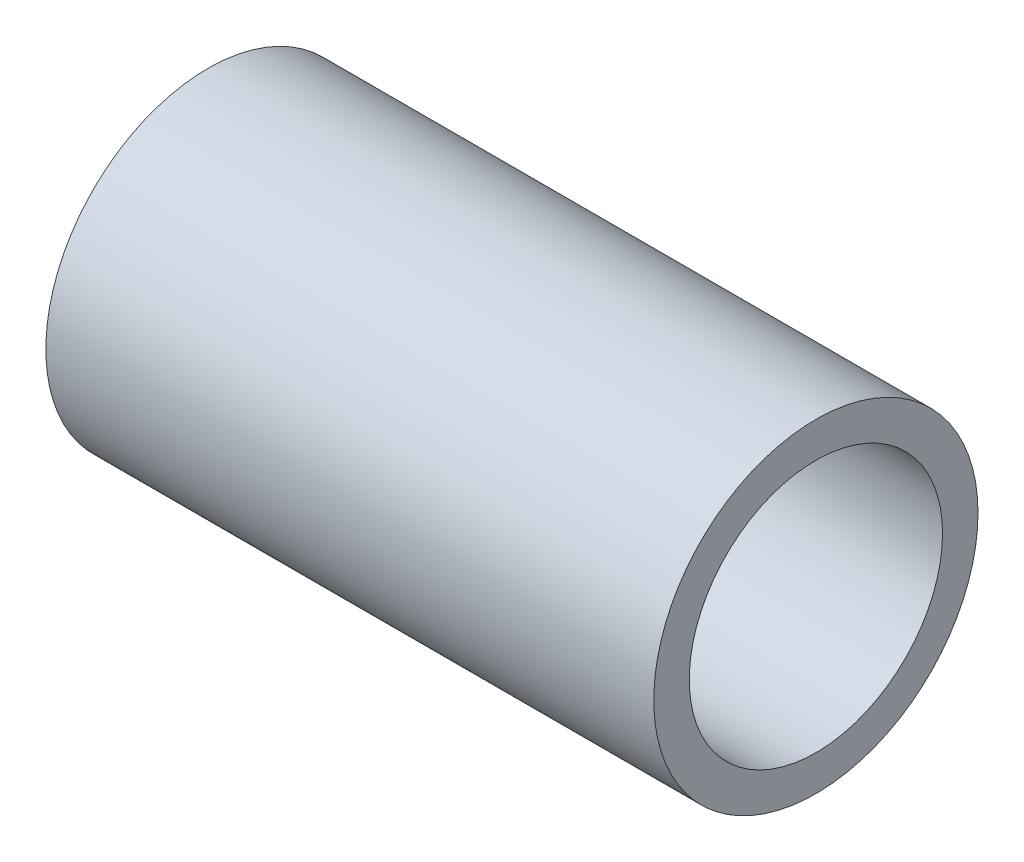
ISO-10303-21;
HEADER;
FILE_DESCRIPTION(('STEP AP214'),'2;1');
FILE_NAME('part.step','',(''),(''),'','','');
FILE_SCHEMA(('AUTOMOTIVE_DESIGN { 1 0 10303 214 1 1 1 1 }'));
ENDSEC;
DATA;
#1=APPLICATION_CONTEXT('core data for automotive mechanical design processes');
#2=APPLICATION_PROTOCOL_DEFINITION('international standard','automotive_design',2000,#1);
#3=PRODUCT_CONTEXT('',#1,'mechanical');
#4=PRODUCT('Part','Part','',(#3));
#5=PRODUCT_RELATED_PRODUCT_CATEGORY('part','',(#4));
#6=PRODUCT_DEFINITION_FORMATION('','',#4);
#7=PRODUCT_DEFINITION_CONTEXT('part definition',#1,'design');
#8=PRODUCT_DEFINITION('design','',#6,#7);
#9=PRODUCT_DEFINITION_SHAPE('','',#8);
#10=(LENGTH_UNIT() NAMED_UNIT(*) SI_UNIT(.MILLI.,.METRE.));
#11=(NAMED_UNIT(*) PLANE_ANGLE_UNIT() SI_UNIT($,.RADIAN.));
#12=(NAMED_UNIT(*) SI_UNIT($,.STERADIAN.) SOLID_ANGLE_UNIT());
#13=UNCERTAINTY_MEASURE_WITH_UNIT(LENGTH_MEASURE(1.E-05),#10,'distance_accuracy_value','');
#14=(GEOMETRIC_REPRESENTATION_CONTEXT(3) GLOBAL_UNCERTAINTY_ASSIGNED_CONTEXT((#13)) GLOBAL_UNIT_ASSIGNED_CONTEXT((#10,
#11,#12)) REPRESENTATION_CONTEXT('',''));
#15=CARTESIAN_POINT('',(0.,0.,0.));
#16=DIRECTION('',(0.,0.,1.));
#17=DIRECTION('',(1.,0.,0.));
#18=AXIS2_PLACEMENT_3D('',#15,#16,#17);
#19=CARTESIAN_POINT('',(30.,0.,0.));
#20=DIRECTION('',(1.,0.,0.));
#21=DIRECTION('',(0.,0.,-1.));
#22=AXIS2_PLACEMENT_3D('',#19,#20,#21);
#23=PLANE('',#22);
#24=CARTESIAN_POINT('',(30.,0.,0.));
#25=DIRECTION('',(1.,0.,0.));
#26=DIRECTION('',(0.,0.,-1.));
#27=AXIS2_PLACEMENT_3D('',#24,#25,#26);
#28=CIRCLE('',#27,8.);
#29=CARTESIAN_POINT('',(30.,0.,-8.));
#30=VERTEX_POINT('',#29);
#31=EDGE_CURVE('E10',#30,#30,#28,.T.);
#32=ORIENTED_EDGE('',*,*,#31,.T.);
#33=EDGE_LOOP('',(#32));
#34=FACE_BOUND('',#33,.T.);
#35=CARTESIAN_POINT('',(30.,0.,0.));
#36=DIRECTION('',(1.,0.,0.));
#37=DIRECTION('',(0.,0.,-1.));
#38=AXIS2_PLACEMENT_3D('',#35,#36,#37);
#39=CIRCLE('',#38,6.25);
#40=CARTESIAN_POINT('',(30.,0.,-6.25));
#41=VERTEX_POINT('',#40);
#42=EDGE_CURVE('E42',#41,#41,#39,.T.);
#43=ORIENTED_EDGE('',*,*,#42,.F.);
#44=EDGE_LOOP('',(#43));
#45=FACE_BOUND('',#44,.T.);
#46=ADVANCED_FACE('F31',(#34,#45),#23,.T.);
#47=CARTESIAN_POINT('',(0.,0.,0.));
#48=DIRECTION('',(1.,0.,0.));
#49=DIRECTION('',(0.,0.,-1.));
#50=AXIS2_PLACEMENT_3D('',#47,#48,#49);
#51=PLANE('',#50);
#52=CARTESIAN_POINT('',(0.,0.,0.));
#53=DIRECTION('',(1.,0.,0.));
#54=DIRECTION('',(0.,0.,-1.));
#55=AXIS2_PLACEMENT_3D('',#52,#53,#54);
#56=CIRCLE('',#55,8.);
#57=CARTESIAN_POINT('',(0.,0.,-8.));
#58=VERTEX_POINT('',#57);
#59=EDGE_CURVE('E35',#58,#58,#56,.T.);
#60=ORIENTED_EDGE('',*,*,#59,.F.);
#61=EDGE_LOOP('',(#60));
#62=FACE_BOUND('',#61,.T.);
#63=CARTESIAN_POINT('',(0.,0.,0.));
#64=DIRECTION('',(1.,0.,0.));
#65=DIRECTION('',(0.,0.,-1.));
#66=AXIS2_PLACEMENT_3D('',#63,#64,#65);
#67=CIRCLE('',#66,6.25);
#68=CARTESIAN_POINT('',(0.,0.,-6.25));
#69=VERTEX_POINT('',#68);
#70=EDGE_CURVE('E44',#69,#69,#67,.T.);
#71=ORIENTED_EDGE('',*,*,#70,.T.);
#72=EDGE_LOOP('',(#71));
#73=FACE_BOUND('',#72,.T.);
#74=ADVANCED_FACE('F54',(#62,#73),#51,.F.);
#75=CARTESIAN_POINT('',(30.,0.,0.));
#76=DIRECTION('',(-1.,0.,0.));
#77=DIRECTION('',(0.,0.,1.));
#78=AXIS2_PLACEMENT_3D('',#75,#76,#77);
#79=CYLINDRICAL_SURFACE('',#78,8.);
#80=ORIENTED_EDGE('',*,*,#31,.F.);
#81=EDGE_LOOP('',(#80));
#82=FACE_BOUND('',#81,.T.);
#83=ORIENTED_EDGE('',*,*,#59,.T.);
#84=EDGE_LOOP('',(#83));
#85=FACE_BOUND('',#84,.T.);
#86=ADVANCED_FACE('F33',(#82,#85),#79,.T.);
#87=CARTESIAN_POINT('',(30.,0.,0.));
#88=DIRECTION('',(-1.,0.,0.));
#89=DIRECTION('',(0.,0.,1.));
#90=AXIS2_PLACEMENT_3D('',#87,#88,#89);
#91=CYLINDRICAL_SURFACE('',#90,6.25);
#92=ORIENTED_EDGE('',*,*,#42,.T.);
#93=EDGE_LOOP('',(#92));
#94=FACE_BOUND('',#93,.T.);
#95=ORIENTED_EDGE('',*,*,#70,.F.);
#96=EDGE_LOOP('',(#95));
#97=FACE_BOUND('',#96,.T.);
#98=ADVANCED_FACE('F50',(#94,#97),#91,.F.);
#99=CLOSED_SHELL('',(#46,#74,#86,#98));
#100=MANIFOLD_SOLID_BREP('B2',#99);
#101=ADVANCED_BREP_SHAPE_REPRESENTATION('',(#18,#100),#14);
#102=SHAPE_DEFINITION_REPRESENTATION(#9,#101);
ENDSEC;
END-ISO-10303-21;
